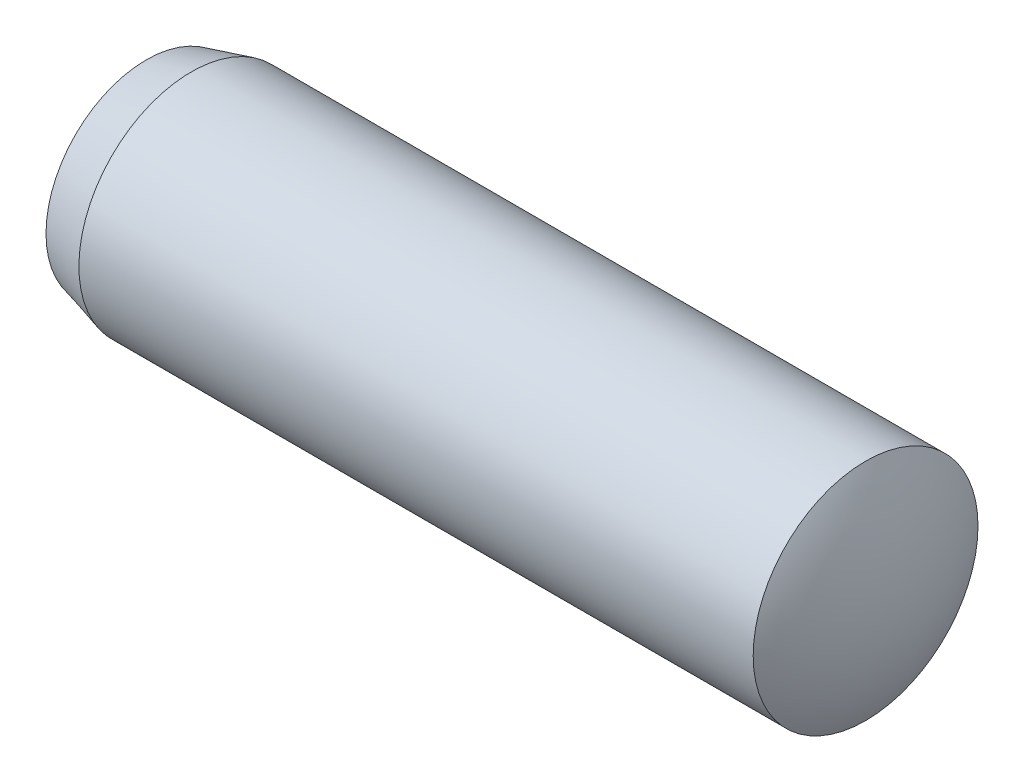
ISO-10303-21;
HEADER;
FILE_DESCRIPTION(('STEP AP214'),'2;1');
FILE_NAME('part.step','',(''),(''),'','','');
FILE_SCHEMA(('AUTOMOTIVE_DESIGN { 1 0 10303 214 1 1 1 1 }'));
ENDSEC;
DATA;
#1=APPLICATION_CONTEXT('core data for automotive mechanical design processes');
#2=APPLICATION_PROTOCOL_DEFINITION('international standard','automotive_design',2000,#1);
#3=PRODUCT_CONTEXT('',#1,'mechanical');
#4=PRODUCT('Part','Part','',(#3));
#5=PRODUCT_RELATED_PRODUCT_CATEGORY('part','',(#4));
#6=PRODUCT_DEFINITION_FORMATION('','',#4);
#7=PRODUCT_DEFINITION_CONTEXT('part definition',#1,'design');
#8=PRODUCT_DEFINITION('design','',#6,#7);
#9=PRODUCT_DEFINITION_SHAPE('','',#8);
#10=(LENGTH_UNIT() NAMED_UNIT(*) SI_UNIT(.MILLI.,.METRE.));
#11=(NAMED_UNIT(*) PLANE_ANGLE_UNIT() SI_UNIT($,.RADIAN.));
#12=(NAMED_UNIT(*) SI_UNIT($,.STERADIAN.) SOLID_ANGLE_UNIT());
#13=UNCERTAINTY_MEASURE_WITH_UNIT(LENGTH_MEASURE(1.E-05),#10,'distance_accuracy_value','');
#14=(GEOMETRIC_REPRESENTATION_CONTEXT(3) GLOBAL_UNCERTAINTY_ASSIGNED_CONTEXT((#13)) GLOBAL_UNIT_ASSIGNED_CONTEXT((#10,
#11,#12)) REPRESENTATION_CONTEXT('',''));
#15=CARTESIAN_POINT('',(0.,0.,0.));
#16=DIRECTION('',(0.,0.,1.));
#17=DIRECTION('',(1.,0.,0.));
#18=AXIS2_PLACEMENT_3D('',#15,#16,#17);
#19=CARTESIAN_POINT('',(0.,0.,0.));
#20=DIRECTION('',(1.,0.,0.));
#21=DIRECTION('',(0.,1.,0.));
#22=AXIS2_PLACEMENT_3D('',#19,#20,#21);
#23=PLANE('',#22);
#24=CARTESIAN_POINT('',(0.,0.,0.));
#25=DIRECTION('',(-1.,0.,0.));
#26=DIRECTION('',(0.,-1.,0.));
#27=AXIS2_PLACEMENT_3D('',#24,#25,#26);
#28=CIRCLE('',#27,0.267846096908265);
#29=CARTESIAN_POINT('',(0.,-0.267846096908265,0.));
#30=VERTEX_POINT('',#29);
#31=EDGE_CURVE('E10',#30,#30,#28,.T.);
#32=ORIENTED_EDGE('',*,*,#31,.T.);
#33=EDGE_LOOP('',(#32));
#34=FACE_BOUND('',#33,.T.);
#35=ADVANCED_FACE('F27',(#34),#23,.F.);
#36=CARTESIAN_POINT('',(0.120000000000002,0.,0.));
#37=DIRECTION('',(1.,0.,0.));
#38=DIRECTION('',(0.,1.,0.));
#39=AXIS2_PLACEMENT_3D('',#36,#37,#38);
#40=CONICAL_SURFACE('',#39,0.300000000000002,0.261799387799159);
#41=ORIENTED_EDGE('',*,*,#31,.F.);
#42=EDGE_LOOP('',(#41));
#43=FACE_BOUND('',#42,.T.);
#44=CARTESIAN_POINT('',(0.120000000000002,0.,0.));
#45=DIRECTION('',(-1.,0.,0.));
#46=DIRECTION('',(0.,-1.,0.));
#47=AXIS2_PLACEMENT_3D('',#44,#45,#46);
#48=CIRCLE('',#47,0.300000000000002);
#49=CARTESIAN_POINT('',(0.120000000000002,-0.300000000000002,0.));
#50=VERTEX_POINT('',#49);
#51=EDGE_CURVE('E33',#50,#50,#48,.T.);
#52=ORIENTED_EDGE('',*,*,#51,.T.);
#53=EDGE_LOOP('',(#52));
#54=FACE_BOUND('',#53,.T.);
#55=ADVANCED_FACE('F52',(#43,#54),#40,.T.);
#56=CARTESIAN_POINT('',(0.,0.,0.));
#57=DIRECTION('',(-1.,0.,0.));
#58=DIRECTION('',(0.,-1.,0.));
#59=AXIS2_PLACEMENT_3D('',#56,#57,#58);
#60=CYLINDRICAL_SURFACE('',#59,0.300000000000001);
#61=ORIENTED_EDGE('',*,*,#51,.F.);
#62=EDGE_LOOP('',(#61));
#63=FACE_BOUND('',#62,.T.);
#64=CARTESIAN_POINT('',(1.91961524227066,0.,0.));
#65=DIRECTION('',(-1.,0.,0.));
#66=DIRECTION('',(0.,-1.,0.));
#67=AXIS2_PLACEMENT_3D('',#64,#65,#66);
#68=CIRCLE('',#67,0.3);
#69=CARTESIAN_POINT('',(1.91961524227066,-0.3,0.));
#70=VERTEX_POINT('',#69);
#71=EDGE_CURVE('E37',#70,#70,#68,.T.);
#72=ORIENTED_EDGE('',*,*,#71,.T.);
#73=EDGE_LOOP('',(#72));
#74=FACE_BOUND('',#73,.T.);
#75=ADVANCED_FACE('F44',(#63,#74),#60,.T.);
#76=CARTESIAN_POINT('',(1.4,0.,0.));
#77=DIRECTION('',(-1.,0.,0.));
#78=DIRECTION('',(0.,1.,0.));
#79=AXIS2_PLACEMENT_3D('',#76,#77,#78);
#80=SPHERICAL_SURFACE('',#79,0.600000000000002);
#81=ORIENTED_EDGE('',*,*,#71,.F.);
#82=EDGE_LOOP('',(#81));
#83=FACE_BOUND('',#82,.T.);
#84=ADVANCED_FACE('F46',(#83),#80,.T.);
#85=CLOSED_SHELL('',(#35,#55,#75,#84));
#86=MANIFOLD_SOLID_BREP('B2',#85);
#87=ADVANCED_BREP_SHAPE_REPRESENTATION('',(#18,#86),#14);
#88=SHAPE_DEFINITION_REPRESENTATION(#9,#87);
ENDSEC;
END-ISO-10303-21;
